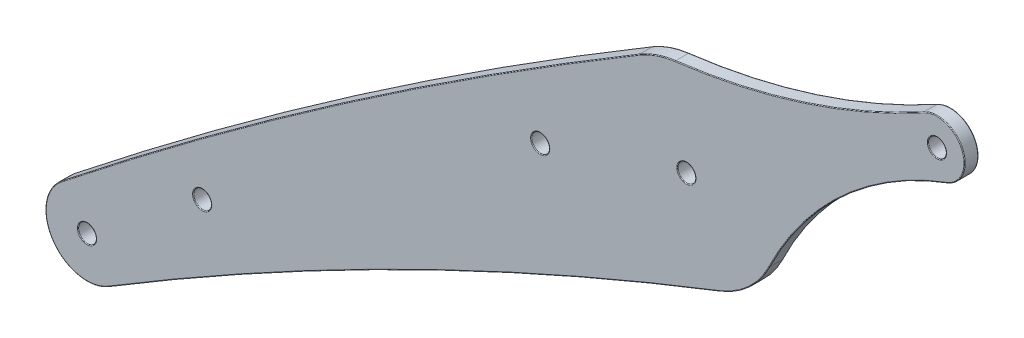
ISO-10303-21;
HEADER;
FILE_DESCRIPTION(('STEP AP214'),'2;1');
FILE_NAME('part.step','',(''),(''),'','','');
FILE_SCHEMA(('AUTOMOTIVE_DESIGN { 1 0 10303 214 1 1 1 1 }'));
ENDSEC;
DATA;
#1=APPLICATION_CONTEXT('core data for automotive mechanical design processes');
#2=APPLICATION_PROTOCOL_DEFINITION('international standard','automotive_design',2000,#1);
#3=PRODUCT_CONTEXT('',#1,'mechanical');
#4=PRODUCT('Part','Part','',(#3));
#5=PRODUCT_RELATED_PRODUCT_CATEGORY('part','',(#4));
#6=PRODUCT_DEFINITION_FORMATION('','',#4);
#7=PRODUCT_DEFINITION_CONTEXT('part definition',#1,'design');
#8=PRODUCT_DEFINITION('design','',#6,#7);
#9=PRODUCT_DEFINITION_SHAPE('','',#8);
#10=(LENGTH_UNIT() NAMED_UNIT(*) SI_UNIT(.MILLI.,.METRE.));
#11=(NAMED_UNIT(*) PLANE_ANGLE_UNIT() SI_UNIT($,.RADIAN.));
#12=(NAMED_UNIT(*) SI_UNIT($,.STERADIAN.) SOLID_ANGLE_UNIT());
#13=UNCERTAINTY_MEASURE_WITH_UNIT(LENGTH_MEASURE(1.E-05),#10,'distance_accuracy_value','');
#14=(GEOMETRIC_REPRESENTATION_CONTEXT(3) GLOBAL_UNCERTAINTY_ASSIGNED_CONTEXT((#13)) GLOBAL_UNIT_ASSIGNED_CONTEXT((#10,
#11,#12)) REPRESENTATION_CONTEXT('',''));
#15=CARTESIAN_POINT('',(0.,0.,0.));
#16=DIRECTION('',(0.,0.,1.));
#17=DIRECTION('',(1.,0.,0.));
#18=AXIS2_PLACEMENT_3D('',#15,#16,#17);
#19=CARTESIAN_POINT('',(-56.8731999979007,200.969479843934,-3.));
#20=DIRECTION('',(0.,0.,1.));
#21=DIRECTION('',(1.,0.,0.));
#22=AXIS2_PLACEMENT_3D('',#19,#20,#21);
#23=CYLINDRICAL_SURFACE('',#22,19.9999999999999);
#24=DIRECTION('',(0.,0.,1.));
#25=VECTOR('',#24,1.);
#26=CARTESIAN_POINT('',(-59.2972491522465,220.822035994146,-3.));
#27=LINE('',#26,#25);
#28=CARTESIAN_POINT('',(-59.2972491522465,220.822035994146,-2.85));
#29=VERTEX_POINT('',#28);
#30=CARTESIAN_POINT('',(-59.2972491522465,220.822035994146,-0.15));
#31=VERTEX_POINT('',#30);
#32=EDGE_CURVE('E153',#29,#31,#27,.T.);
#33=ORIENTED_EDGE('',*,*,#32,.F.);
#34=CARTESIAN_POINT('',(-56.8731999979007,200.969479843934,-2.85));
#35=DIRECTION('',(0.,0.,-1.));
#36=DIRECTION('',(-1.,0.,0.));
#37=AXIS2_PLACEMENT_3D('',#34,#35,#36);
#38=CIRCLE('',#37,19.9999999999999);
#39=CARTESIAN_POINT('',(-67.1157791789713,218.147651216914,-2.85));
#40=VERTEX_POINT('',#39);
#41=EDGE_CURVE('E148',#29,#40,#38,.F.);
#42=ORIENTED_EDGE('',*,*,#41,.T.);
#43=DIRECTION('',(0.,0.,1.));
#44=VECTOR('',#43,1.);
#45=CARTESIAN_POINT('',(-67.1157791789713,218.147651216914,-3.));
#46=LINE('',#45,#44);
#47=CARTESIAN_POINT('',(-67.1157791789713,218.147651216914,-0.15));
#48=VERTEX_POINT('',#47);
#49=EDGE_CURVE('E150',#40,#48,#46,.T.);
#50=ORIENTED_EDGE('',*,*,#49,.T.);
#51=CARTESIAN_POINT('',(-56.8731999979007,200.969479843934,-0.15));
#52=DIRECTION('',(0.,0.,-1.));
#53=DIRECTION('',(-1.,0.,0.));
#54=AXIS2_PLACEMENT_3D('',#51,#52,#53);
#55=CIRCLE('',#54,19.9999999999999);
#56=EDGE_CURVE('E159',#48,#31,#55,.T.);
#57=ORIENTED_EDGE('',*,*,#56,.T.);
#58=EDGE_LOOP('',(#33,#42,#50,#57));
#59=FACE_BOUND('',#58,.T.);
#60=ADVANCED_FACE('F34',(#59),#23,.T.);
#61=CARTESIAN_POINT('',(-77.4776178098393,369.716207120735,-3.));
#62=DIRECTION('',(0.,0.,1.));
#63=DIRECTION('',(1.,0.,0.));
#64=AXIS2_PLACEMENT_3D('',#61,#62,#63);
#65=CYLINDRICAL_SURFACE('',#64,150.);
#66=DIRECTION('',(0.,0.,1.));
#67=VECTOR('',#66,1.);
#68=CARTESIAN_POINT('',(-5.36711574066759,238.186455766404,-3.));
#69=LINE('',#68,#67);
#70=CARTESIAN_POINT('',(-5.36711574066759,238.186455766404,-2.85));
#71=VERTEX_POINT('',#70);
#72=CARTESIAN_POINT('',(-5.36711574066759,238.186455766404,-0.15));
#73=VERTEX_POINT('',#72);
#74=EDGE_CURVE('E370',#71,#73,#69,.T.);
#75=ORIENTED_EDGE('',*,*,#74,.F.);
#76=CARTESIAN_POINT('',(-77.4776178098393,369.716207120735,-2.85));
#77=DIRECTION('',(0.,0.,-1.));
#78=DIRECTION('',(-1.,0.,0.));
#79=AXIS2_PLACEMENT_3D('',#76,#77,#78);
#80=CIRCLE('',#79,150.);
#81=EDGE_CURVE('E242',#71,#29,#80,.T.);
#82=ORIENTED_EDGE('',*,*,#81,.T.);
#83=ORIENTED_EDGE('',*,*,#32,.T.);
#84=CARTESIAN_POINT('',(-77.4776178098393,369.716207120735,-0.15));
#85=DIRECTION('',(0.,0.,-1.));
#86=DIRECTION('',(-1.,0.,0.));
#87=AXIS2_PLACEMENT_3D('',#84,#85,#86);
#88=CIRCLE('',#87,150.);
#89=EDGE_CURVE('E239',#31,#73,#88,.F.);
#90=ORIENTED_EDGE('',*,*,#89,.T.);
#91=EDGE_LOOP('',(#75,#82,#83,#90));
#92=FACE_BOUND('',#91,.T.);
#93=ADVANCED_FACE('F376',(#92),#65,.F.);
#94=CARTESIAN_POINT('',(-2.48269565790066,232.925265712231,-3.));
#95=DIRECTION('',(0.,0.,1.));
#96=DIRECTION('',(1.,0.,0.));
#97=AXIS2_PLACEMENT_3D('',#94,#95,#96);
#98=CYLINDRICAL_SURFACE('',#97,6.00000000000003);
#99=DIRECTION('',(0.,0.,1.));
#100=VECTOR('',#99,1.);
#101=CARTESIAN_POINT('',(-0.3821118583825,227.304985674617,-3.));
#102=LINE('',#101,#100);
#103=CARTESIAN_POINT('',(-0.3821118583825,227.304985674617,-2.85));
#104=VERTEX_POINT('',#103);
#105=CARTESIAN_POINT('',(-0.3821118583825,227.304985674617,-0.15));
#106=VERTEX_POINT('',#105);
#107=EDGE_CURVE('E367',#104,#106,#102,.T.);
#108=ORIENTED_EDGE('',*,*,#107,.F.);
#109=CARTESIAN_POINT('',(-2.48269565790066,232.925265712231,-2.85));
#110=DIRECTION('',(0.,0.,-1.));
#111=DIRECTION('',(-1.,0.,0.));
#112=AXIS2_PLACEMENT_3D('',#109,#110,#111);
#113=CIRCLE('',#112,6.00000000000003);
#114=EDGE_CURVE('E237',#104,#71,#113,.F.);
#115=ORIENTED_EDGE('',*,*,#114,.T.);
#116=ORIENTED_EDGE('',*,*,#74,.T.);
#117=CARTESIAN_POINT('',(-2.48269565790066,232.925265712231,-0.15));
#118=DIRECTION('',(0.,0.,-1.));
#119=DIRECTION('',(-1.,0.,0.));
#120=AXIS2_PLACEMENT_3D('',#117,#118,#119);
#121=CIRCLE('',#120,6.00000000000003);
#122=EDGE_CURVE('E235',#73,#106,#121,.T.);
#123=ORIENTED_EDGE('',*,*,#122,.T.);
#124=EDGE_LOOP('',(#108,#115,#116,#123));
#125=FACE_BOUND('',#124,.T.);
#126=ADVANCED_FACE('F430',(#125),#98,.T.);
#127=CARTESIAN_POINT('',(24.1246991359958,161.735051902454,-3.));
#128=DIRECTION('',(0.,0.,1.));
#129=DIRECTION('',(1.,0.,0.));
#130=AXIS2_PLACEMENT_3D('',#127,#128,#129);
#131=CYLINDRICAL_SURFACE('',#130,70.);
#132=DIRECTION('',(0.,0.,1.));
#133=VECTOR('',#132,1.);
#134=CARTESIAN_POINT('',(-38.8736668570348,192.250718079161,-3.));
#135=LINE('',#134,#133);
#136=CARTESIAN_POINT('',(-38.8736668570348,192.250718079161,-2.85));
#137=VERTEX_POINT('',#136);
#138=CARTESIAN_POINT('',(-38.8736668570348,192.250718079161,-0.15));
#139=VERTEX_POINT('',#138);
#140=EDGE_CURVE('E361',#137,#139,#135,.T.);
#141=ORIENTED_EDGE('',*,*,#140,.F.);
#142=CARTESIAN_POINT('',(24.1246991359958,161.735051902454,-2.85));
#143=DIRECTION('',(0.,0.,-1.));
#144=DIRECTION('',(-1.,0.,0.));
#145=AXIS2_PLACEMENT_3D('',#142,#143,#144);
#146=CIRCLE('',#145,70.);
#147=EDGE_CURVE('E233',#137,#104,#146,.T.);
#148=ORIENTED_EDGE('',*,*,#147,.T.);
#149=ORIENTED_EDGE('',*,*,#107,.T.);
#150=CARTESIAN_POINT('',(24.1246991359958,161.735051902454,-0.15));
#151=DIRECTION('',(0.,0.,-1.));
#152=DIRECTION('',(-1.,0.,0.));
#153=AXIS2_PLACEMENT_3D('',#150,#151,#152);
#154=CIRCLE('',#153,70.);
#155=EDGE_CURVE('E231',#106,#139,#154,.F.);
#156=ORIENTED_EDGE('',*,*,#155,.T.);
#157=EDGE_LOOP('',(#141,#148,#149,#156));
#158=FACE_BOUND('',#157,.T.);
#159=ADVANCED_FACE('F724',(#158),#131,.F.);
#160=CARTESIAN_POINT('',(-56.8731999979007,200.969479843934,-3.));
#161=DIRECTION('',(0.,0.,1.));
#162=DIRECTION('',(1.,0.,0.));
#163=AXIS2_PLACEMENT_3D('',#160,#161,#162);
#164=CYLINDRICAL_SURFACE('',#163,20.0000000000001);
#165=DIRECTION('',(0.,0.,1.));
#166=VECTOR('',#165,1.);
#167=CARTESIAN_POINT('',(-49.6156195126461,182.332754662184,-3.));
#168=LINE('',#167,#166);
#169=CARTESIAN_POINT('',(-49.6156195126461,182.332754662184,-2.85));
#170=VERTEX_POINT('',#169);
#171=CARTESIAN_POINT('',(-49.6156195126461,182.332754662184,-0.15));
#172=VERTEX_POINT('',#171);
#173=EDGE_CURVE('E357',#170,#172,#168,.T.);
#174=ORIENTED_EDGE('',*,*,#173,.F.);
#175=CARTESIAN_POINT('',(-56.8731999979007,200.969479843934,-2.85));
#176=DIRECTION('',(0.,0.,-1.));
#177=DIRECTION('',(-1.,0.,0.));
#178=AXIS2_PLACEMENT_3D('',#175,#176,#177);
#179=CIRCLE('',#178,20.0000000000001);
#180=EDGE_CURVE('E229',#170,#137,#179,.F.);
#181=ORIENTED_EDGE('',*,*,#180,.T.);
#182=ORIENTED_EDGE('',*,*,#140,.T.);
#183=CARTESIAN_POINT('',(-56.8731999979007,200.969479843934,-0.15));
#184=DIRECTION('',(0.,0.,-1.));
#185=DIRECTION('',(-1.,0.,0.));
#186=AXIS2_PLACEMENT_3D('',#183,#184,#185);
#187=CIRCLE('',#186,20.0000000000001);
#188=EDGE_CURVE('E227',#139,#172,#187,.T.);
#189=ORIENTED_EDGE('',*,*,#188,.T.);
#190=EDGE_LOOP('',(#174,#181,#182,#189));
#191=FACE_BOUND('',#190,.T.);
#192=ADVANCED_FACE('F716',(#191),#164,.T.);
#193=CARTESIAN_POINT('',(258.831551110671,-609.728065562166,-3.));
#194=DIRECTION('',(0.,0.,1.));
#195=DIRECTION('',(1.,0.,0.));
#196=AXIS2_PLACEMENT_3D('',#193,#194,#195);
#197=CYLINDRICAL_SURFACE('',#196,850.);
#198=DIRECTION('',(0.,0.,1.));
#199=VECTOR('',#198,1.);
#200=CARTESIAN_POINT('',(-182.322813028778,116.82738793104,-3.));
#201=LINE('',#200,#199);
#202=CARTESIAN_POINT('',(-182.322813028778,116.82738793104,-2.85));
#203=VERTEX_POINT('',#202);
#204=CARTESIAN_POINT('',(-182.322813028778,116.82738793104,-0.15));
#205=VERTEX_POINT('',#204);
#206=EDGE_CURVE('E354',#203,#205,#201,.T.);
#207=ORIENTED_EDGE('',*,*,#206,.F.);
#208=CARTESIAN_POINT('',(258.831551110671,-609.728065562166,-2.85));
#209=DIRECTION('',(0.,0.,-1.));
#210=DIRECTION('',(-1.,0.,0.));
#211=AXIS2_PLACEMENT_3D('',#208,#209,#210);
#212=CIRCLE('',#211,850.);
#213=EDGE_CURVE('E225',#203,#170,#212,.T.);
#214=ORIENTED_EDGE('',*,*,#213,.T.);
#215=ORIENTED_EDGE('',*,*,#173,.T.);
#216=CARTESIAN_POINT('',(258.831551110671,-609.728065562166,-0.15));
#217=DIRECTION('',(0.,0.,-1.));
#218=DIRECTION('',(-1.,0.,0.));
#219=AXIS2_PLACEMENT_3D('',#216,#217,#218);
#220=CIRCLE('',#219,850.);
#221=EDGE_CURVE('E223',#172,#205,#220,.F.);
#222=ORIENTED_EDGE('',*,*,#221,.T.);
#223=EDGE_LOOP('',(#207,#214,#215,#222));
#224=FACE_BOUND('',#223,.T.);
#225=ADVANCED_FACE('F353',(#224),#197,.F.);
#226=CARTESIAN_POINT('',(-186.993859237313,124.520328026851,-3.));
#227=DIRECTION('',(0.,0.,1.));
#228=DIRECTION('',(1.,0.,0.));
#229=AXIS2_PLACEMENT_3D('',#226,#227,#228);
#230=CYLINDRICAL_SURFACE('',#229,8.99999999999998);
#231=DIRECTION('',(0.,0.,1.));
#232=VECTOR('',#231,1.);
#233=CARTESIAN_POINT('',(-192.584952529802,131.572964115201,-3.));
#234=LINE('',#233,#232);
#235=CARTESIAN_POINT('',(-192.584952529802,131.572964115201,-2.85));
#236=VERTEX_POINT('',#235);
#237=CARTESIAN_POINT('',(-192.584952529802,131.572964115201,-0.15));
#238=VERTEX_POINT('',#237);
#239=EDGE_CURVE('E170',#236,#238,#234,.T.);
#240=ORIENTED_EDGE('',*,*,#239,.F.);
#241=CARTESIAN_POINT('',(-186.993859237313,124.520328026851,-2.85));
#242=DIRECTION('',(0.,0.,-1.));
#243=DIRECTION('',(-1.,0.,0.));
#244=AXIS2_PLACEMENT_3D('',#241,#242,#243);
#245=CIRCLE('',#244,8.99999999999998);
#246=EDGE_CURVE('E221',#236,#203,#245,.F.);
#247=ORIENTED_EDGE('',*,*,#246,.T.);
#248=ORIENTED_EDGE('',*,*,#206,.T.);
#249=CARTESIAN_POINT('',(-186.993859237313,124.520328026851,-0.15));
#250=DIRECTION('',(0.,0.,-1.));
#251=DIRECTION('',(-1.,0.,0.));
#252=AXIS2_PLACEMENT_3D('',#249,#250,#251);
#253=CIRCLE('',#252,8.99999999999998);
#254=EDGE_CURVE('E219',#205,#238,#253,.T.);
#255=ORIENTED_EDGE('',*,*,#254,.T.);
#256=EDGE_LOOP('',(#240,#247,#248,#255));
#257=FACE_BOUND('',#256,.T.);
#258=ADVANCED_FACE('F359',(#257),#230,.T.);
#259=CARTESIAN_POINT('',(521.832523732588,-769.597202729485,-3.));
#260=DIRECTION('',(0.,0.,1.));
#261=DIRECTION('',(1.,0.,0.));
#262=AXIS2_PLACEMENT_3D('',#259,#260,#261);
#263=CYLINDRICAL_SURFACE('',#262,1150.);
#264=ORIENTED_EDGE('',*,*,#49,.F.);
#265=CARTESIAN_POINT('',(521.832523732588,-769.597202729485,-2.85));
#266=DIRECTION('',(0.,0.,-1.));
#267=DIRECTION('',(-1.,0.,0.));
#268=AXIS2_PLACEMENT_3D('',#265,#266,#267);
#269=CIRCLE('',#268,1150.);
#270=EDGE_CURVE('E166',#40,#236,#269,.F.);
#271=ORIENTED_EDGE('',*,*,#270,.T.);
#272=ORIENTED_EDGE('',*,*,#239,.T.);
#273=CARTESIAN_POINT('',(521.832523732588,-769.597202729485,-0.15));
#274=DIRECTION('',(0.,0.,-1.));
#275=DIRECTION('',(-1.,0.,0.));
#276=AXIS2_PLACEMENT_3D('',#273,#274,#275);
#277=CIRCLE('',#276,1150.);
#278=EDGE_CURVE('E169',#238,#48,#277,.T.);
#279=ORIENTED_EDGE('',*,*,#278,.T.);
#280=EDGE_LOOP('',(#264,#271,#272,#279));
#281=FACE_BOUND('',#280,.T.);
#282=ADVANCED_FACE('F163',(#281),#263,.T.);
#283=CARTESIAN_POINT('',(-67.17540890387,285.342843482334,-3.));
#284=DIRECTION('',(0.,0.,-1.));
#285=DIRECTION('',(-1.,0.,0.));
#286=AXIS2_PLACEMENT_3D('',#283,#284,#285);
#287=PLANE('',#286);
#288=CARTESIAN_POINT('',(-186.993859237313,124.520328026851,-3.));
#289=DIRECTION('',(0.,0.,-1.));
#290=DIRECTION('',(-1.,0.,0.));
#291=AXIS2_PLACEMENT_3D('',#288,#289,#290);
#292=CIRCLE('',#291,8.84999999999998);
#293=CARTESIAN_POINT('',(-182.40066379892,116.955603599304,-3.));
#294=VERTEX_POINT('',#293);
#295=CARTESIAN_POINT('',(-192.491767641593,131.455420180395,-3.));
#296=VERTEX_POINT('',#295);
#297=EDGE_CURVE('E215',#294,#296,#292,.T.);
#298=ORIENTED_EDGE('',*,*,#297,.T.);
#299=CARTESIAN_POINT('',(521.832523732588,-769.597202729485,-3.));
#300=DIRECTION('',(0.,0.,-1.));
#301=DIRECTION('',(-1.,0.,0.));
#302=AXIS2_PLACEMENT_3D('',#299,#300,#301);
#303=CIRCLE('',#302,1149.85);
#304=CARTESIAN_POINT('',(-67.0389598351133,218.018814931617,-3.));
#305=VERTEX_POINT('',#304);
#306=EDGE_CURVE('E217',#296,#305,#303,.T.);
#307=ORIENTED_EDGE('',*,*,#306,.T.);
#308=CARTESIAN_POINT('',(-56.8731999979007,200.969479843934,-3.));
#309=DIRECTION('',(0.,0.,-1.));
#310=DIRECTION('',(-1.,0.,0.));
#311=AXIS2_PLACEMENT_3D('',#308,#309,#310);
#312=CIRCLE('',#311,19.8499999999999);
#313=CARTESIAN_POINT('',(-59.2790687835889,220.673141823019,-3.));
#314=VERTEX_POINT('',#313);
#315=EDGE_CURVE('E176',#305,#314,#312,.T.);
#316=ORIENTED_EDGE('',*,*,#315,.T.);
#317=CARTESIAN_POINT('',(-77.4776178098393,369.716207120735,-3.));
#318=DIRECTION('',(0.,0.,-1.));
#319=DIRECTION('',(-1.,0.,0.));
#320=AXIS2_PLACEMENT_3D('',#317,#318,#319);
#321=CIRCLE('',#320,150.15);
#322=CARTESIAN_POINT('',(-5.29500523859841,238.05492601505,-3.));
#323=VERTEX_POINT('',#322);
#324=EDGE_CURVE('E205',#314,#323,#321,.F.);
#325=ORIENTED_EDGE('',*,*,#324,.T.);
#326=CARTESIAN_POINT('',(-2.48269565790066,232.925265712231,-3.));
#327=DIRECTION('',(0.,0.,-1.));
#328=DIRECTION('',(-1.,0.,0.));
#329=AXIS2_PLACEMENT_3D('',#326,#327,#328);
#330=CIRCLE('',#329,5.85000000000003);
#331=CARTESIAN_POINT('',(-0.434626453370453,227.445492675558,-3.));
#332=VERTEX_POINT('',#331);
#333=EDGE_CURVE('E207',#323,#332,#330,.T.);
#334=ORIENTED_EDGE('',*,*,#333,.T.);
#335=CARTESIAN_POINT('',(24.1246991359958,161.735051902454,-3.));
#336=DIRECTION('',(0.,0.,-1.));
#337=DIRECTION('',(-1.,0.,0.));
#338=AXIS2_PLACEMENT_3D('',#335,#336,#337);
#339=CIRCLE('',#338,70.15);
#340=CARTESIAN_POINT('',(-39.0086633555913,192.316108792396,-3.));
#341=VERTEX_POINT('',#340);
#342=EDGE_CURVE('E209',#332,#341,#339,.F.);
#343=ORIENTED_EDGE('',*,*,#342,.T.);
#344=CARTESIAN_POINT('',(-56.8731999979007,200.969479843934,-3.));
#345=DIRECTION('',(0.,0.,-1.));
#346=DIRECTION('',(-1.,0.,0.));
#347=AXIS2_PLACEMENT_3D('',#344,#345,#346);
#348=CIRCLE('',#347,19.8500000000001);
#349=CARTESIAN_POINT('',(-49.6700513662855,182.472530101047,-3.));
#350=VERTEX_POINT('',#349);
#351=EDGE_CURVE('E211',#341,#350,#348,.T.);
#352=ORIENTED_EDGE('',*,*,#351,.T.);
#353=CARTESIAN_POINT('',(258.831551110671,-609.728065562166,-3.));
#354=DIRECTION('',(0.,0.,-1.));
#355=DIRECTION('',(-1.,0.,0.));
#356=AXIS2_PLACEMENT_3D('',#353,#354,#355);
#357=CIRCLE('',#356,850.15);
#358=EDGE_CURVE('E213',#350,#294,#357,.F.);
#359=ORIENTED_EDGE('',*,*,#358,.T.);
#360=EDGE_LOOP('',(#298,#307,#316,#325,#334,#343,#352,#359));
#361=FACE_BOUND('',#360,.T.);
#362=CARTESIAN_POINT('',(-2.48269565790066,232.925265712231,-3.));
#363=DIRECTION('',(0.,0.,-1.));
#364=DIRECTION('',(-1.,0.,0.));
#365=AXIS2_PLACEMENT_3D('',#362,#363,#364);
#366=CIRCLE('',#365,2.1);
#367=CARTESIAN_POINT('',(-4.58269565790066,232.925265712231,-3.));
#368=VERTEX_POINT('',#367);
#369=EDGE_CURVE('E201',#368,#368,#366,.F.);
#370=ORIENTED_EDGE('',*,*,#369,.T.);
#371=EDGE_LOOP('',(#370));
#372=FACE_BOUND('',#371,.T.);
#373=CARTESIAN_POINT('',(-56.8731999979007,200.969479843934,-3.));
#374=DIRECTION('',(0.,0.,-1.));
#375=DIRECTION('',(-1.,0.,0.));
#376=AXIS2_PLACEMENT_3D('',#373,#374,#375);
#377=CIRCLE('',#376,2.1);
#378=CARTESIAN_POINT('',(-58.9731999979007,200.969479843934,-3.));
#379=VERTEX_POINT('',#378);
#380=EDGE_CURVE('E198',#379,#379,#377,.F.);
#381=ORIENTED_EDGE('',*,*,#380,.T.);
#382=EDGE_LOOP('',(#381));
#383=FACE_BOUND('',#382,.T.);
#384=CARTESIAN_POINT('',(-88.6231999979007,190.664661820758,-3.));
#385=DIRECTION('',(0.,0.,-1.));
#386=DIRECTION('',(-1.,0.,0.));
#387=AXIS2_PLACEMENT_3D('',#384,#385,#386);
#388=CIRCLE('',#387,2.09999999999999);
#389=CARTESIAN_POINT('',(-90.7231999979007,190.664661820758,-3.));
#390=VERTEX_POINT('',#389);
#391=EDGE_CURVE('E195',#390,#390,#388,.F.);
#392=ORIENTED_EDGE('',*,*,#391,.T.);
#393=EDGE_LOOP('',(#392));
#394=FACE_BOUND('',#393,.T.);
#395=CARTESIAN_POINT('',(-161.993859237313,143.416067608263,-3.));
#396=DIRECTION('',(0.,0.,-1.));
#397=DIRECTION('',(-1.,0.,0.));
#398=AXIS2_PLACEMENT_3D('',#395,#396,#397);
#399=CIRCLE('',#398,2.10000000000001);
#400=CARTESIAN_POINT('',(-164.093859237313,143.416067608263,-3.));
#401=VERTEX_POINT('',#400);
#402=EDGE_CURVE('E189',#401,#401,#399,.F.);
#403=ORIENTED_EDGE('',*,*,#402,.T.);
#404=EDGE_LOOP('',(#403));
#405=FACE_BOUND('',#404,.T.);
#406=CARTESIAN_POINT('',(-186.993859237313,124.520328026851,-3.));
#407=DIRECTION('',(0.,0.,-1.));
#408=DIRECTION('',(-1.,0.,0.));
#409=AXIS2_PLACEMENT_3D('',#406,#407,#408);
#410=CIRCLE('',#409,2.10000000000001);
#411=CARTESIAN_POINT('',(-189.093859237313,124.520328026851,-3.));
#412=VERTEX_POINT('',#411);
#413=EDGE_CURVE('E186',#412,#412,#410,.F.);
#414=ORIENTED_EDGE('',*,*,#413,.T.);
#415=EDGE_LOOP('',(#414));
#416=FACE_BOUND('',#415,.T.);
#417=ADVANCED_FACE('F392',(#361,#372,#383,#394,#405,#416),#287,.T.);
#418=CARTESIAN_POINT('',(-67.17540890387,285.342843482334,0.));
#419=DIRECTION('',(0.,0.,-1.));
#420=DIRECTION('',(-1.,0.,0.));
#421=AXIS2_PLACEMENT_3D('',#418,#419,#420);
#422=PLANE('',#421);
#423=CARTESIAN_POINT('',(-2.48269565790066,232.925265712231,0.));
#424=DIRECTION('',(0.,0.,-1.));
#425=DIRECTION('',(-1.,0.,0.));
#426=AXIS2_PLACEMENT_3D('',#423,#424,#425);
#427=CIRCLE('',#426,5.85000000000003);
#428=CARTESIAN_POINT('',(-0.434626453370453,227.445492675558,0.));
#429=VERTEX_POINT('',#428);
#430=CARTESIAN_POINT('',(-5.29500523859842,238.05492601505,0.));
#431=VERTEX_POINT('',#430);
#432=EDGE_CURVE('E43',#429,#431,#427,.F.);
#433=ORIENTED_EDGE('',*,*,#432,.T.);
#434=CARTESIAN_POINT('',(-77.4776178098393,369.716207120735,0.));
#435=DIRECTION('',(0.,0.,-1.));
#436=DIRECTION('',(-1.,0.,0.));
#437=AXIS2_PLACEMENT_3D('',#434,#435,#436);
#438=CIRCLE('',#437,150.15);
#439=CARTESIAN_POINT('',(-59.2790687835889,220.673141823019,0.));
#440=VERTEX_POINT('',#439);
#441=EDGE_CURVE('E11',#431,#440,#438,.T.);
#442=ORIENTED_EDGE('',*,*,#441,.T.);
#443=CARTESIAN_POINT('',(-56.8731999979007,200.969479843934,0.));
#444=DIRECTION('',(0.,0.,-1.));
#445=DIRECTION('',(-1.,0.,0.));
#446=AXIS2_PLACEMENT_3D('',#443,#444,#445);
#447=CIRCLE('',#446,19.8499999999999);
#448=CARTESIAN_POINT('',(-67.0389598351133,218.018814931617,0.));
#449=VERTEX_POINT('',#448);
#450=EDGE_CURVE('E289',#440,#449,#447,.F.);
#451=ORIENTED_EDGE('',*,*,#450,.T.);
#452=CARTESIAN_POINT('',(521.832523732588,-769.597202729485,0.));
#453=DIRECTION('',(0.,0.,-1.));
#454=DIRECTION('',(-1.,0.,0.));
#455=AXIS2_PLACEMENT_3D('',#452,#453,#454);
#456=CIRCLE('',#455,1149.85);
#457=CARTESIAN_POINT('',(-192.491767641593,131.455420180394,0.));
#458=VERTEX_POINT('',#457);
#459=EDGE_CURVE('E291',#449,#458,#456,.F.);
#460=ORIENTED_EDGE('',*,*,#459,.T.);
#461=CARTESIAN_POINT('',(-186.993859237313,124.520328026851,0.));
#462=DIRECTION('',(0.,0.,-1.));
#463=DIRECTION('',(-1.,0.,0.));
#464=AXIS2_PLACEMENT_3D('',#461,#462,#463);
#465=CIRCLE('',#464,8.84999999999998);
#466=CARTESIAN_POINT('',(-182.40066379892,116.955603599304,0.));
#467=VERTEX_POINT('',#466);
#468=EDGE_CURVE('E293',#458,#467,#465,.F.);
#469=ORIENTED_EDGE('',*,*,#468,.T.);
#470=CARTESIAN_POINT('',(258.831551110671,-609.728065562166,0.));
#471=DIRECTION('',(0.,0.,-1.));
#472=DIRECTION('',(-1.,0.,0.));
#473=AXIS2_PLACEMENT_3D('',#470,#471,#472);
#474=CIRCLE('',#473,850.15);
#475=CARTESIAN_POINT('',(-49.6700513662854,182.472530101047,0.));
#476=VERTEX_POINT('',#475);
#477=EDGE_CURVE('E295',#467,#476,#474,.T.);
#478=ORIENTED_EDGE('',*,*,#477,.T.);
#479=CARTESIAN_POINT('',(-56.8731999979007,200.969479843934,0.));
#480=DIRECTION('',(0.,0.,-1.));
#481=DIRECTION('',(-1.,0.,0.));
#482=AXIS2_PLACEMENT_3D('',#479,#480,#481);
#483=CIRCLE('',#482,19.8500000000001);
#484=CARTESIAN_POINT('',(-39.0086633555912,192.316108792396,0.));
#485=VERTEX_POINT('',#484);
#486=EDGE_CURVE('E297',#476,#485,#483,.F.);
#487=ORIENTED_EDGE('',*,*,#486,.T.);
#488=CARTESIAN_POINT('',(24.1246991359958,161.735051902454,0.));
#489=DIRECTION('',(0.,0.,-1.));
#490=DIRECTION('',(-1.,0.,0.));
#491=AXIS2_PLACEMENT_3D('',#488,#489,#490);
#492=CIRCLE('',#491,70.15);
#493=EDGE_CURVE('E54',#485,#429,#492,.T.);
#494=ORIENTED_EDGE('',*,*,#493,.T.);
#495=EDGE_LOOP('',(#433,#442,#451,#460,#469,#478,#487,#494));
#496=FACE_BOUND('',#495,.T.);
#497=CARTESIAN_POINT('',(-2.48269565790066,232.925265712231,0.));
#498=DIRECTION('',(0.,0.,-1.));
#499=DIRECTION('',(-1.,0.,0.));
#500=AXIS2_PLACEMENT_3D('',#497,#498,#499);
#501=CIRCLE('',#500,2.1);
#502=CARTESIAN_POINT('',(-4.58269565790066,232.925265712231,0.));
#503=VERTEX_POINT('',#502);
#504=EDGE_CURVE('E286',#503,#503,#501,.T.);
#505=ORIENTED_EDGE('',*,*,#504,.T.);
#506=EDGE_LOOP('',(#505));
#507=FACE_BOUND('',#506,.T.);
#508=CARTESIAN_POINT('',(-56.8731999979007,200.969479843934,0.));
#509=DIRECTION('',(0.,0.,-1.));
#510=DIRECTION('',(-1.,0.,0.));
#511=AXIS2_PLACEMENT_3D('',#508,#509,#510);
#512=CIRCLE('',#511,2.1);
#513=CARTESIAN_POINT('',(-58.9731999979007,200.969479843934,0.));
#514=VERTEX_POINT('',#513);
#515=EDGE_CURVE('E283',#514,#514,#512,.T.);
#516=ORIENTED_EDGE('',*,*,#515,.T.);
#517=EDGE_LOOP('',(#516));
#518=FACE_BOUND('',#517,.T.);
#519=CARTESIAN_POINT('',(-88.6231999979007,190.664661820758,0.));
#520=DIRECTION('',(0.,0.,-1.));
#521=DIRECTION('',(-1.,0.,0.));
#522=AXIS2_PLACEMENT_3D('',#519,#520,#521);
#523=CIRCLE('',#522,2.09999999999999);
#524=CARTESIAN_POINT('',(-90.7231999979007,190.664661820758,0.));
#525=VERTEX_POINT('',#524);
#526=EDGE_CURVE('E280',#525,#525,#523,.T.);
#527=ORIENTED_EDGE('',*,*,#526,.T.);
#528=EDGE_LOOP('',(#527));
#529=FACE_BOUND('',#528,.T.);
#530=CARTESIAN_POINT('',(-161.993859237313,143.416067608263,0.));
#531=DIRECTION('',(0.,0.,-1.));
#532=DIRECTION('',(-1.,0.,0.));
#533=AXIS2_PLACEMENT_3D('',#530,#531,#532);
#534=CIRCLE('',#533,2.10000000000001);
#535=CARTESIAN_POINT('',(-164.093859237313,143.416067608263,0.));
#536=VERTEX_POINT('',#535);
#537=EDGE_CURVE('E277',#536,#536,#534,.T.);
#538=ORIENTED_EDGE('',*,*,#537,.T.);
#539=EDGE_LOOP('',(#538));
#540=FACE_BOUND('',#539,.T.);
#541=CARTESIAN_POINT('',(-186.993859237313,124.520328026851,0.));
#542=DIRECTION('',(0.,0.,-1.));
#543=DIRECTION('',(-1.,0.,0.));
#544=AXIS2_PLACEMENT_3D('',#541,#542,#543);
#545=CIRCLE('',#544,2.10000000000001);
#546=CARTESIAN_POINT('',(-189.093859237313,124.520328026851,0.));
#547=VERTEX_POINT('',#546);
#548=EDGE_CURVE('E274',#547,#547,#545,.T.);
#549=ORIENTED_EDGE('',*,*,#548,.T.);
#550=EDGE_LOOP('',(#549));
#551=FACE_BOUND('',#550,.T.);
#552=ADVANCED_FACE('F388',(#496,#507,#518,#529,#540,#551),#422,.F.);
#553=CARTESIAN_POINT('',(-2.48269565790066,232.925265712231,0.));
#554=DIRECTION('',(0.,0.,1.));
#555=DIRECTION('',(1.,0.,0.));
#556=AXIS2_PLACEMENT_3D('',#553,#554,#555);
#557=CYLINDRICAL_SURFACE('',#556,1.95);
#558=CARTESIAN_POINT('',(-2.48269565790066,232.925265712231,-2.85));
#559=DIRECTION('',(0.,0.,-1.));
#560=DIRECTION('',(-1.,0.,0.));
#561=AXIS2_PLACEMENT_3D('',#558,#559,#560);
#562=CIRCLE('',#561,1.95);
#563=CARTESIAN_POINT('',(-4.43269565790066,232.925265712231,-2.85));
#564=VERTEX_POINT('',#563);
#565=EDGE_CURVE('E247',#564,#564,#562,.T.);
#566=ORIENTED_EDGE('',*,*,#565,.T.);
#567=EDGE_LOOP('',(#566));
#568=FACE_BOUND('',#567,.T.);
#569=CARTESIAN_POINT('',(-2.48269565790066,232.925265712231,-0.15));
#570=DIRECTION('',(0.,0.,-1.));
#571=DIRECTION('',(-1.,0.,0.));
#572=AXIS2_PLACEMENT_3D('',#569,#570,#571);
#573=CIRCLE('',#572,1.95);
#574=CARTESIAN_POINT('',(-4.43269565790066,232.925265712231,-0.15));
#575=VERTEX_POINT('',#574);
#576=EDGE_CURVE('E158',#575,#575,#573,.F.);
#577=ORIENTED_EDGE('',*,*,#576,.T.);
#578=EDGE_LOOP('',(#577));
#579=FACE_BOUND('',#578,.T.);
#580=ADVANCED_FACE('F391',(#568,#579),#557,.F.);
#581=CARTESIAN_POINT('',(-56.8731999979007,200.969479843934,0.));
#582=DIRECTION('',(0.,0.,1.));
#583=DIRECTION('',(1.,0.,0.));
#584=AXIS2_PLACEMENT_3D('',#581,#582,#583);
#585=CYLINDRICAL_SURFACE('',#584,1.95);
#586=CARTESIAN_POINT('',(-56.8731999979007,200.969479843934,-2.85));
#587=DIRECTION('',(0.,0.,-1.));
#588=DIRECTION('',(-1.,0.,0.));
#589=AXIS2_PLACEMENT_3D('',#586,#587,#588);
#590=CIRCLE('',#589,1.95);
#591=CARTESIAN_POINT('',(-58.8231999979007,200.969479843934,-2.85));
#592=VERTEX_POINT('',#591);
#593=EDGE_CURVE('E253',#592,#592,#590,.T.);
#594=ORIENTED_EDGE('',*,*,#593,.T.);
#595=EDGE_LOOP('',(#594));
#596=FACE_BOUND('',#595,.T.);
#597=CARTESIAN_POINT('',(-56.8731999979007,200.969479843934,-0.15));
#598=DIRECTION('',(0.,0.,-1.));
#599=DIRECTION('',(-1.,0.,0.));
#600=AXIS2_PLACEMENT_3D('',#597,#598,#599);
#601=CIRCLE('',#600,1.95);
#602=CARTESIAN_POINT('',(-58.8231999979007,200.969479843934,-0.15));
#603=VERTEX_POINT('',#602);
#604=EDGE_CURVE('E250',#603,#603,#601,.F.);
#605=ORIENTED_EDGE('',*,*,#604,.T.);
#606=EDGE_LOOP('',(#605));
#607=FACE_BOUND('',#606,.T.);
#608=ADVANCED_FACE('F665',(#596,#607),#585,.F.);
#609=CARTESIAN_POINT('',(-88.6231999979007,190.664661820758,0.));
#610=DIRECTION('',(0.,0.,1.));
#611=DIRECTION('',(1.,0.,0.));
#612=AXIS2_PLACEMENT_3D('',#609,#610,#611);
#613=CYLINDRICAL_SURFACE('',#612,1.94999999999999);
#614=CARTESIAN_POINT('',(-88.6231999979007,190.664661820758,-2.85));
#615=DIRECTION('',(0.,0.,-1.));
#616=DIRECTION('',(-1.,0.,0.));
#617=AXIS2_PLACEMENT_3D('',#614,#615,#616);
#618=CIRCLE('',#617,1.94999999999999);
#619=CARTESIAN_POINT('',(-90.5731999979007,190.664661820758,-2.85));
#620=VERTEX_POINT('',#619);
#621=EDGE_CURVE('E259',#620,#620,#618,.T.);
#622=ORIENTED_EDGE('',*,*,#621,.T.);
#623=EDGE_LOOP('',(#622));
#624=FACE_BOUND('',#623,.T.);
#625=CARTESIAN_POINT('',(-88.6231999979007,190.664661820758,-0.15));
#626=DIRECTION('',(0.,0.,-1.));
#627=DIRECTION('',(-1.,0.,0.));
#628=AXIS2_PLACEMENT_3D('',#625,#626,#627);
#629=CIRCLE('',#628,1.94999999999999);
#630=CARTESIAN_POINT('',(-90.5731999979007,190.664661820758,-0.15));
#631=VERTEX_POINT('',#630);
#632=EDGE_CURVE('E256',#631,#631,#629,.F.);
#633=ORIENTED_EDGE('',*,*,#632,.T.);
#634=EDGE_LOOP('',(#633));
#635=FACE_BOUND('',#634,.T.);
#636=ADVANCED_FACE('F422',(#624,#635),#613,.F.);
#637=CARTESIAN_POINT('',(-161.993859237313,143.416067608263,0.));
#638=DIRECTION('',(0.,0.,1.));
#639=DIRECTION('',(1.,0.,0.));
#640=AXIS2_PLACEMENT_3D('',#637,#638,#639);
#641=CYLINDRICAL_SURFACE('',#640,1.95000000000001);
#642=CARTESIAN_POINT('',(-161.993859237313,143.416067608263,-2.85));
#643=DIRECTION('',(0.,0.,-1.));
#644=DIRECTION('',(-1.,0.,0.));
#645=AXIS2_PLACEMENT_3D('',#642,#643,#644);
#646=CIRCLE('',#645,1.95000000000001);
#647=CARTESIAN_POINT('',(-163.943859237313,143.416067608263,-2.85));
#648=VERTEX_POINT('',#647);
#649=EDGE_CURVE('E265',#648,#648,#646,.T.);
#650=ORIENTED_EDGE('',*,*,#649,.T.);
#651=EDGE_LOOP('',(#650));
#652=FACE_BOUND('',#651,.T.);
#653=CARTESIAN_POINT('',(-161.993859237313,143.416067608263,-0.15));
#654=DIRECTION('',(0.,0.,-1.));
#655=DIRECTION('',(-1.,0.,0.));
#656=AXIS2_PLACEMENT_3D('',#653,#654,#655);
#657=CIRCLE('',#656,1.95000000000001);
#658=CARTESIAN_POINT('',(-163.943859237313,143.416067608263,-0.15));
#659=VERTEX_POINT('',#658);
#660=EDGE_CURVE('E262',#659,#659,#657,.F.);
#661=ORIENTED_EDGE('',*,*,#660,.T.);
#662=EDGE_LOOP('',(#661));
#663=FACE_BOUND('',#662,.T.);
#664=ADVANCED_FACE('F412',(#652,#663),#641,.F.);
#665=CARTESIAN_POINT('',(-186.993859237313,124.520328026851,0.));
#666=DIRECTION('',(0.,0.,1.));
#667=DIRECTION('',(1.,0.,0.));
#668=AXIS2_PLACEMENT_3D('',#665,#666,#667);
#669=CYLINDRICAL_SURFACE('',#668,1.95000000000001);
#670=CARTESIAN_POINT('',(-186.993859237313,124.520328026851,-2.85));
#671=DIRECTION('',(0.,0.,-1.));
#672=DIRECTION('',(-1.,0.,0.));
#673=AXIS2_PLACEMENT_3D('',#670,#671,#672);
#674=CIRCLE('',#673,1.95000000000001);
#675=CARTESIAN_POINT('',(-188.943859237313,124.520328026851,-2.85));
#676=VERTEX_POINT('',#675);
#677=EDGE_CURVE('E271',#676,#676,#674,.T.);
#678=ORIENTED_EDGE('',*,*,#677,.T.);
#679=EDGE_LOOP('',(#678));
#680=FACE_BOUND('',#679,.T.);
#681=CARTESIAN_POINT('',(-186.993859237313,124.520328026851,-0.15));
#682=DIRECTION('',(0.,0.,-1.));
#683=DIRECTION('',(-1.,0.,0.));
#684=AXIS2_PLACEMENT_3D('',#681,#682,#683);
#685=CIRCLE('',#684,1.95000000000001);
#686=CARTESIAN_POINT('',(-188.943859237313,124.520328026851,-0.15));
#687=VERTEX_POINT('',#686);
#688=EDGE_CURVE('E268',#687,#687,#685,.F.);
#689=ORIENTED_EDGE('',*,*,#688,.T.);
#690=EDGE_LOOP('',(#689));
#691=FACE_BOUND('',#690,.T.);
#692=ADVANCED_FACE('F409',(#680,#691),#669,.F.);
#693=CARTESIAN_POINT('',(24.1246991359958,161.735051902454,-2.85));
#694=DIRECTION('',(0.,0.,-1.));
#695=DIRECTION('',(-1.,0.,0.));
#696=AXIS2_PLACEMENT_3D('',#693,#694,#695);
#697=TOROIDAL_SURFACE('',#696,70.15,0.15);
#698=CARTESIAN_POINT('',(-39.0086633555913,192.316108792396,-2.85));
#699=DIRECTION('',(-0.435938088238644,-0.899976657043302,0.));
#700=DIRECTION('',(0.899976657043302,-0.435938088238644,0.));
#701=AXIS2_PLACEMENT_3D('',#698,#699,#700);
#702=CIRCLE('',#701,0.15);
#703=EDGE_CURVE('E312',#341,#137,#702,.T.);
#704=ORIENTED_EDGE('',*,*,#703,.F.);
#705=ORIENTED_EDGE('',*,*,#342,.F.);
#706=CARTESIAN_POINT('',(-0.434626453370453,227.445492675558,-2.85));
#707=DIRECTION('',(0.936713339602321,0.350097299919703,0.));
#708=DIRECTION('',(-0.350097299919703,0.936713339602321,0.));
#709=AXIS2_PLACEMENT_3D('',#706,#707,#708);
#710=CIRCLE('',#709,0.15);
#711=EDGE_CURVE('E171',#104,#332,#710,.T.);
#712=ORIENTED_EDGE('',*,*,#711,.F.);
#713=ORIENTED_EDGE('',*,*,#147,.F.);
#714=EDGE_LOOP('',(#704,#705,#712,#713));
#715=FACE_BOUND('',#714,.T.);
#716=ADVANCED_FACE('F411',(#715),#697,.T.);
#717=CARTESIAN_POINT('',(-2.48269565790066,232.925265712231,-2.85));
#718=DIRECTION('',(0.,0.,-1.));
#719=DIRECTION('',(-1.,0.,0.));
#720=AXIS2_PLACEMENT_3D('',#717,#718,#719);
#721=TOROIDAL_SURFACE('',#720,5.85000000000003,0.15);
#722=ORIENTED_EDGE('',*,*,#711,.T.);
#723=ORIENTED_EDGE('',*,*,#333,.F.);
#724=CARTESIAN_POINT('',(-5.29500523859841,238.05492601505,-2.85));
#725=DIRECTION('',(-0.876865009028867,-0.480736680461149,0.));
#726=DIRECTION('',(0.480736680461149,-0.876865009028867,0.));
#727=AXIS2_PLACEMENT_3D('',#724,#725,#726);
#728=CIRCLE('',#727,0.15);
#729=EDGE_CURVE('E309',#71,#323,#728,.T.);
#730=ORIENTED_EDGE('',*,*,#729,.F.);
#731=ORIENTED_EDGE('',*,*,#114,.F.);
#732=EDGE_LOOP('',(#722,#723,#730,#731));
#733=FACE_BOUND('',#732,.T.);
#734=ADVANCED_FACE('F419',(#733),#721,.T.);
#735=CARTESIAN_POINT('',(-56.8731999979007,200.969479843934,-2.85));
#736=DIRECTION('',(0.,0.,-1.));
#737=DIRECTION('',(-1.,0.,0.));
#738=AXIS2_PLACEMENT_3D('',#735,#736,#737);
#739=TOROIDAL_SURFACE('',#738,19.8500000000001,0.15);
#740=ORIENTED_EDGE('',*,*,#703,.T.);
#741=ORIENTED_EDGE('',*,*,#180,.F.);
#742=CARTESIAN_POINT('',(-49.6700513662855,182.472530101047,-2.85));
#743=DIRECTION('',(-0.931836259087469,-0.36287902426273,0.));
#744=DIRECTION('',(0.36287902426273,-0.931836259087469,0.));
#745=AXIS2_PLACEMENT_3D('',#742,#743,#744);
#746=CIRCLE('',#745,0.15);
#747=EDGE_CURVE('E306',#350,#170,#746,.T.);
#748=ORIENTED_EDGE('',*,*,#747,.F.);
#749=ORIENTED_EDGE('',*,*,#351,.F.);
#750=EDGE_LOOP('',(#740,#741,#748,#749));
#751=FACE_BOUND('',#750,.T.);
#752=ADVANCED_FACE('F451',(#751),#739,.T.);
#753=CARTESIAN_POINT('',(-77.4776178098393,369.716207120735,-2.85));
#754=DIRECTION('',(0.,0.,-1.));
#755=DIRECTION('',(-1.,0.,0.));
#756=AXIS2_PLACEMENT_3D('',#753,#754,#755);
#757=TOROIDAL_SURFACE('',#756,150.15,0.15);
#758=ORIENTED_EDGE('',*,*,#729,.T.);
#759=ORIENTED_EDGE('',*,*,#324,.F.);
#760=CARTESIAN_POINT('',(-59.2790687835889,220.673141823019,-2.85));
#761=DIRECTION('',(-0.992627807510597,-0.121202457717263,0.));
#762=DIRECTION('',(0.121202457717263,-0.992627807510597,0.));
#763=AXIS2_PLACEMENT_3D('',#760,#761,#762);
#764=CIRCLE('',#763,0.15);
#765=EDGE_CURVE('E304',#29,#314,#764,.T.);
#766=ORIENTED_EDGE('',*,*,#765,.F.);
#767=ORIENTED_EDGE('',*,*,#81,.F.);
#768=EDGE_LOOP('',(#758,#759,#766,#767));
#769=FACE_BOUND('',#768,.T.);
#770=ADVANCED_FACE('F447',(#769),#757,.T.);
#771=CARTESIAN_POINT('',(258.831551110671,-609.728065562166,-2.85));
#772=DIRECTION('',(0.,0.,-1.));
#773=DIRECTION('',(-1.,0.,0.));
#774=AXIS2_PLACEMENT_3D('',#771,#772,#773);
#775=TOROIDAL_SURFACE('',#774,850.15,0.15);
#776=ORIENTED_EDGE('',*,*,#747,.T.);
#777=ORIENTED_EDGE('',*,*,#213,.F.);
#778=CARTESIAN_POINT('',(-182.40066379892,116.955603599304,-2.85));
#779=DIRECTION('',(-0.854771121756756,-0.519005134281634,0.));
#780=DIRECTION('',(0.519005134281634,-0.854771121756756,0.));
#781=AXIS2_PLACEMENT_3D('',#778,#779,#780);
#782=CIRCLE('',#781,0.15);
#783=EDGE_CURVE('E180',#294,#203,#782,.T.);
#784=ORIENTED_EDGE('',*,*,#783,.F.);
#785=ORIENTED_EDGE('',*,*,#358,.F.);
#786=EDGE_LOOP('',(#776,#777,#784,#785));
#787=FACE_BOUND('',#786,.T.);
#788=ADVANCED_FACE('F444',(#787),#775,.T.);
#789=CARTESIAN_POINT('',(-56.8731999979007,200.969479843934,-2.85));
#790=DIRECTION('',(0.,0.,-1.));
#791=DIRECTION('',(-1.,0.,0.));
#792=AXIS2_PLACEMENT_3D('',#789,#790,#791);
#793=TOROIDAL_SURFACE('',#792,19.8499999999999,0.15);
#794=ORIENTED_EDGE('',*,*,#765,.T.);
#795=ORIENTED_EDGE('',*,*,#315,.F.);
#796=CARTESIAN_POINT('',(-67.0389598351133,218.018814931617,-2.85));
#797=DIRECTION('',(-0.858908568649049,-0.512128959053521,0.));
#798=DIRECTION('',(0.512128959053521,-0.858908568649049,0.));
#799=AXIS2_PLACEMENT_3D('',#796,#797,#798);
#800=CIRCLE('',#799,0.15);
#801=EDGE_CURVE('E174',#40,#305,#800,.T.);
#802=ORIENTED_EDGE('',*,*,#801,.F.);
#803=ORIENTED_EDGE('',*,*,#41,.F.);
#804=EDGE_LOOP('',(#794,#795,#802,#803));
#805=FACE_BOUND('',#804,.T.);
#806=ADVANCED_FACE('F175',(#805),#793,.T.);
#807=CARTESIAN_POINT('',(-186.993859237313,124.520328026851,-2.85));
#808=DIRECTION('',(0.,0.,-1.));
#809=DIRECTION('',(-1.,0.,0.));
#810=AXIS2_PLACEMENT_3D('',#807,#808,#809);
#811=TOROIDAL_SURFACE('',#810,8.84999999999998,0.15);
#812=ORIENTED_EDGE('',*,*,#783,.T.);
#813=ORIENTED_EDGE('',*,*,#246,.F.);
#814=CARTESIAN_POINT('',(-192.491767641593,131.455420180395,-2.85));
#815=DIRECTION('',(0.783626232038966,0.621232588054113,0.));
#816=DIRECTION('',(-0.621232588054114,0.783626232038967,0.));
#817=AXIS2_PLACEMENT_3D('',#814,#815,#816);
#818=CIRCLE('',#817,0.15);
#819=EDGE_CURVE('E181',#296,#236,#818,.T.);
#820=ORIENTED_EDGE('',*,*,#819,.F.);
#821=ORIENTED_EDGE('',*,*,#297,.F.);
#822=EDGE_LOOP('',(#812,#813,#820,#821));
#823=FACE_BOUND('',#822,.T.);
#824=ADVANCED_FACE('F438',(#823),#811,.T.);
#825=CARTESIAN_POINT('',(521.832523732588,-769.597202729485,-2.85));
#826=DIRECTION('',(0.,0.,-1.));
#827=DIRECTION('',(-1.,0.,0.));
#828=AXIS2_PLACEMENT_3D('',#825,#826,#827);
#829=TOROIDAL_SURFACE('',#828,1149.85,0.15);
#830=ORIENTED_EDGE('',*,*,#801,.T.);
#831=ORIENTED_EDGE('',*,*,#306,.F.);
#832=ORIENTED_EDGE('',*,*,#819,.T.);
#833=ORIENTED_EDGE('',*,*,#270,.F.);
#834=EDGE_LOOP('',(#830,#831,#832,#833));
#835=FACE_BOUND('',#834,.T.);
#836=ADVANCED_FACE('F183',(#835),#829,.T.);
#837=CARTESIAN_POINT('',(-2.48269565790066,232.925265712231,-2.85));
#838=DIRECTION('',(0.,0.,-1.));
#839=DIRECTION('',(-1.,0.,0.));
#840=AXIS2_PLACEMENT_3D('',#837,#838,#839);
#841=TOROIDAL_SURFACE('',#840,2.1,0.15);
#842=ORIENTED_EDGE('',*,*,#565,.F.);
#843=EDGE_LOOP('',(#842));
#844=FACE_BOUND('',#843,.T.);
#845=ORIENTED_EDGE('',*,*,#369,.F.);
#846=EDGE_LOOP('',(#845));
#847=FACE_BOUND('',#846,.T.);
#848=ADVANCED_FACE('F437',(#844,#847),#841,.T.);
#849=CARTESIAN_POINT('',(-56.8731999979007,200.969479843934,-2.85));
#850=DIRECTION('',(0.,0.,-1.));
#851=DIRECTION('',(-1.,0.,0.));
#852=AXIS2_PLACEMENT_3D('',#849,#850,#851);
#853=TOROIDAL_SURFACE('',#852,2.1,0.15);
#854=ORIENTED_EDGE('',*,*,#593,.F.);
#855=EDGE_LOOP('',(#854));
#856=FACE_BOUND('',#855,.T.);
#857=ORIENTED_EDGE('',*,*,#380,.F.);
#858=EDGE_LOOP('',(#857));
#859=FACE_BOUND('',#858,.T.);
#860=ADVANCED_FACE('F461',(#856,#859),#853,.T.);
#861=CARTESIAN_POINT('',(-88.6231999979007,190.664661820758,-2.85));
#862=DIRECTION('',(0.,0.,-1.));
#863=DIRECTION('',(-1.,0.,0.));
#864=AXIS2_PLACEMENT_3D('',#861,#862,#863);
#865=TOROIDAL_SURFACE('',#864,2.09999999999999,0.15);
#866=ORIENTED_EDGE('',*,*,#621,.F.);
#867=EDGE_LOOP('',(#866));
#868=FACE_BOUND('',#867,.T.);
#869=ORIENTED_EDGE('',*,*,#391,.F.);
#870=EDGE_LOOP('',(#869));
#871=FACE_BOUND('',#870,.T.);
#872=ADVANCED_FACE('F465',(#868,#871),#865,.T.);
#873=CARTESIAN_POINT('',(-161.993859237313,143.416067608263,-2.85));
#874=DIRECTION('',(0.,0.,-1.));
#875=DIRECTION('',(-1.,0.,0.));
#876=AXIS2_PLACEMENT_3D('',#873,#874,#875);
#877=TOROIDAL_SURFACE('',#876,2.10000000000001,0.15);
#878=ORIENTED_EDGE('',*,*,#649,.F.);
#879=EDGE_LOOP('',(#878));
#880=FACE_BOUND('',#879,.T.);
#881=ORIENTED_EDGE('',*,*,#402,.F.);
#882=EDGE_LOOP('',(#881));
#883=FACE_BOUND('',#882,.T.);
#884=ADVANCED_FACE('F469',(#880,#883),#877,.T.);
#885=CARTESIAN_POINT('',(-186.993859237313,124.520328026851,-2.85));
#886=DIRECTION('',(0.,0.,-1.));
#887=DIRECTION('',(-1.,0.,0.));
#888=AXIS2_PLACEMENT_3D('',#885,#886,#887);
#889=TOROIDAL_SURFACE('',#888,2.10000000000001,0.15);
#890=ORIENTED_EDGE('',*,*,#677,.F.);
#891=EDGE_LOOP('',(#890));
#892=FACE_BOUND('',#891,.T.);
#893=ORIENTED_EDGE('',*,*,#413,.F.);
#894=EDGE_LOOP('',(#893));
#895=FACE_BOUND('',#894,.T.);
#896=ADVANCED_FACE('F473',(#892,#895),#889,.T.);
#897=CARTESIAN_POINT('',(258.831551110671,-609.728065562166,-0.15));
#898=DIRECTION('',(0.,0.,-1.));
#899=DIRECTION('',(-1.,0.,0.));
#900=AXIS2_PLACEMENT_3D('',#897,#898,#899);
#901=TOROIDAL_SURFACE('',#900,850.15,0.15);
#902=CARTESIAN_POINT('',(-182.40066379892,116.955603599304,-0.15));
#903=DIRECTION('',(-0.854771121756731,-0.519005134281675,0.));
#904=DIRECTION('',(0.519005134281675,-0.854771121756732,0.));
#905=AXIS2_PLACEMENT_3D('',#902,#903,#904);
#906=CIRCLE('',#905,0.15);
#907=EDGE_CURVE('E332',#205,#467,#906,.T.);
#908=ORIENTED_EDGE('',*,*,#907,.F.);
#909=ORIENTED_EDGE('',*,*,#221,.F.);
#910=CARTESIAN_POINT('',(-49.6700513662854,182.472530101047,-0.15));
#911=DIRECTION('',(0.931836259087469,0.36287902426273,0.));
#912=DIRECTION('',(-0.36287902426273,0.931836259087469,0.));
#913=AXIS2_PLACEMENT_3D('',#910,#911,#912);
#914=CIRCLE('',#913,0.15);
#915=EDGE_CURVE('E38',#476,#172,#914,.T.);
#916=ORIENTED_EDGE('',*,*,#915,.F.);
#917=ORIENTED_EDGE('',*,*,#477,.F.);
#918=EDGE_LOOP('',(#908,#909,#916,#917));
#919=FACE_BOUND('',#918,.T.);
#920=ADVANCED_FACE('F348',(#919),#901,.T.);
#921=CARTESIAN_POINT('',(-56.8731999979007,200.969479843934,-0.15));
#922=DIRECTION('',(0.,0.,-1.));
#923=DIRECTION('',(-1.,0.,0.));
#924=AXIS2_PLACEMENT_3D('',#921,#922,#923);
#925=TOROIDAL_SURFACE('',#924,19.8500000000001,0.15);
#926=ORIENTED_EDGE('',*,*,#915,.T.);
#927=ORIENTED_EDGE('',*,*,#188,.F.);
#928=CARTESIAN_POINT('',(-39.0086633555912,192.316108792396,-0.15));
#929=DIRECTION('',(0.435938088238662,0.899976657043293,0.));
#930=DIRECTION('',(-0.899976657043293,0.435938088238662,0.));
#931=AXIS2_PLACEMENT_3D('',#928,#929,#930);
#932=CIRCLE('',#931,0.15);
#933=EDGE_CURVE('E330',#485,#139,#932,.T.);
#934=ORIENTED_EDGE('',*,*,#933,.F.);
#935=ORIENTED_EDGE('',*,*,#486,.F.);
#936=EDGE_LOOP('',(#926,#927,#934,#935));
#937=FACE_BOUND('',#936,.T.);
#938=ADVANCED_FACE('F343',(#937),#925,.T.);
#939=CARTESIAN_POINT('',(-186.993859237313,124.520328026851,-0.15));
#940=DIRECTION('',(0.,0.,-1.));
#941=DIRECTION('',(-1.,0.,0.));
#942=AXIS2_PLACEMENT_3D('',#939,#940,#941);
#943=TOROIDAL_SURFACE('',#942,8.84999999999998,0.15);
#944=ORIENTED_EDGE('',*,*,#907,.T.);
#945=ORIENTED_EDGE('',*,*,#468,.F.);
#946=CARTESIAN_POINT('',(-192.491767641593,131.455420180395,-0.15));
#947=DIRECTION('',(0.783626232038876,0.621232588054227,-1.14951120484213E-13));
#948=DIRECTION('',(-0.621232588054227,0.783626232038877,0.));
#949=AXIS2_PLACEMENT_3D('',#946,#947,#948);
#950=CIRCLE('',#949,0.15);
#951=EDGE_CURVE('E327',#238,#458,#950,.T.);
#952=ORIENTED_EDGE('',*,*,#951,.F.);
#953=ORIENTED_EDGE('',*,*,#254,.F.);
#954=EDGE_LOOP('',(#944,#945,#952,#953));
#955=FACE_BOUND('',#954,.T.);
#956=ADVANCED_FACE('F494',(#955),#943,.T.);
#957=CARTESIAN_POINT('',(24.1246991359958,161.735051902454,-0.15));
#958=DIRECTION('',(0.,0.,-1.));
#959=DIRECTION('',(-1.,0.,0.));
#960=AXIS2_PLACEMENT_3D('',#957,#958,#959);
#961=TOROIDAL_SURFACE('',#960,70.15,0.15);
#962=ORIENTED_EDGE('',*,*,#933,.T.);
#963=ORIENTED_EDGE('',*,*,#155,.F.);
#964=CARTESIAN_POINT('',(-0.434626453370453,227.445492675558,-0.15));
#965=DIRECTION('',(0.936713339602316,0.350097299919717,0.));
#966=DIRECTION('',(-0.350097299919717,0.936713339602316,0.));
#967=AXIS2_PLACEMENT_3D('',#964,#965,#966);
#968=CIRCLE('',#967,0.15);
#969=EDGE_CURVE('E324',#429,#106,#968,.T.);
#970=ORIENTED_EDGE('',*,*,#969,.F.);
#971=ORIENTED_EDGE('',*,*,#493,.F.);
#972=EDGE_LOOP('',(#962,#963,#970,#971));
#973=FACE_BOUND('',#972,.T.);
#974=ADVANCED_FACE('F490',(#973),#961,.T.);
#975=CARTESIAN_POINT('',(521.832523732588,-769.597202729485,-0.15));
#976=DIRECTION('',(0.,0.,-1.));
#977=DIRECTION('',(-1.,0.,0.));
#978=AXIS2_PLACEMENT_3D('',#975,#976,#977);
#979=TOROIDAL_SURFACE('',#978,1149.85,0.15);
#980=ORIENTED_EDGE('',*,*,#951,.T.);
#981=ORIENTED_EDGE('',*,*,#459,.F.);
#982=CARTESIAN_POINT('',(-67.0389598351132,218.018814931617,-0.15));
#983=DIRECTION('',(0.858908568649049,0.512128959053521,0.));
#984=DIRECTION('',(-0.512128959053521,0.858908568649049,0.));
#985=AXIS2_PLACEMENT_3D('',#982,#983,#984);
#986=CIRCLE('',#985,0.15);
#987=EDGE_CURVE('E321',#48,#449,#986,.T.);
#988=ORIENTED_EDGE('',*,*,#987,.F.);
#989=ORIENTED_EDGE('',*,*,#278,.F.);
#990=EDGE_LOOP('',(#980,#981,#988,#989));
#991=FACE_BOUND('',#990,.T.);
#992=ADVANCED_FACE('F486',(#991),#979,.T.);
#993=CARTESIAN_POINT('',(-2.48269565790066,232.925265712231,-0.15));
#994=DIRECTION('',(0.,0.,-1.));
#995=DIRECTION('',(-1.,0.,0.));
#996=AXIS2_PLACEMENT_3D('',#993,#994,#995);
#997=TOROIDAL_SURFACE('',#996,5.85000000000003,0.15);
#998=ORIENTED_EDGE('',*,*,#969,.T.);
#999=ORIENTED_EDGE('',*,*,#122,.F.);
#1000=CARTESIAN_POINT('',(-5.29500523859842,238.05492601505,-0.15));
#1001=DIRECTION('',(-0.876865009028877,-0.480736680461131,0.));
#1002=DIRECTION('',(0.480736680461131,-0.876865009028877,0.));
#1003=AXIS2_PLACEMENT_3D('',#1000,#1001,#1002);
#1004=CIRCLE('',#1003,0.15);
#1005=EDGE_CURVE('E319',#431,#73,#1004,.T.);
#1006=ORIENTED_EDGE('',*,*,#1005,.F.);
#1007=ORIENTED_EDGE('',*,*,#432,.F.);
#1008=EDGE_LOOP('',(#998,#999,#1006,#1007));
#1009=FACE_BOUND('',#1008,.T.);
#1010=ADVANCED_FACE('F483',(#1009),#997,.T.);
#1011=CARTESIAN_POINT('',(-56.8731999979007,200.969479843934,-0.15));
#1012=DIRECTION('',(0.,0.,-1.));
#1013=DIRECTION('',(-1.,0.,0.));
#1014=AXIS2_PLACEMENT_3D('',#1011,#1012,#1013);
#1015=TOROIDAL_SURFACE('',#1014,19.8499999999999,0.15);
#1016=ORIENTED_EDGE('',*,*,#987,.T.);
#1017=ORIENTED_EDGE('',*,*,#450,.F.);
#1018=CARTESIAN_POINT('',(-59.2790687835889,220.673141823019,-0.15));
#1019=DIRECTION('',(0.992627807510597,0.121202457717263,0.));
#1020=DIRECTION('',(-0.121202457717263,0.992627807510597,0.));
#1021=AXIS2_PLACEMENT_3D('',#1018,#1019,#1020);
#1022=CIRCLE('',#1021,0.15);
#1023=EDGE_CURVE('E317',#31,#440,#1022,.T.);
#1024=ORIENTED_EDGE('',*,*,#1023,.F.);
#1025=ORIENTED_EDGE('',*,*,#56,.F.);
#1026=EDGE_LOOP('',(#1016,#1017,#1024,#1025));
#1027=FACE_BOUND('',#1026,.T.);
#1028=ADVANCED_FACE('F386',(#1027),#1015,.T.);
#1029=CARTESIAN_POINT('',(-77.4776178098393,369.716207120735,-0.15));
#1030=DIRECTION('',(0.,0.,-1.));
#1031=DIRECTION('',(-1.,0.,0.));
#1032=AXIS2_PLACEMENT_3D('',#1029,#1030,#1031);
#1033=TOROIDAL_SURFACE('',#1032,150.15,0.15);
#1034=ORIENTED_EDGE('',*,*,#1005,.T.);
#1035=ORIENTED_EDGE('',*,*,#89,.F.);
#1036=ORIENTED_EDGE('',*,*,#1023,.T.);
#1037=ORIENTED_EDGE('',*,*,#441,.F.);
#1038=EDGE_LOOP('',(#1034,#1035,#1036,#1037));
#1039=FACE_BOUND('',#1038,.T.);
#1040=ADVANCED_FACE('F380',(#1039),#1033,.T.);
#1041=CARTESIAN_POINT('',(-2.48269565790066,232.925265712231,-0.15));
#1042=DIRECTION('',(0.,0.,-1.));
#1043=DIRECTION('',(-1.,0.,0.));
#1044=AXIS2_PLACEMENT_3D('',#1041,#1042,#1043);
#1045=TOROIDAL_SURFACE('',#1044,2.1,0.15);
#1046=ORIENTED_EDGE('',*,*,#504,.F.);
#1047=EDGE_LOOP('',(#1046));
#1048=FACE_BOUND('',#1047,.T.);
#1049=ORIENTED_EDGE('',*,*,#576,.F.);
#1050=EDGE_LOOP('',(#1049));
#1051=FACE_BOUND('',#1050,.T.);
#1052=ADVANCED_FACE('F480',(#1048,#1051),#1045,.T.);
#1053=CARTESIAN_POINT('',(-56.8731999979007,200.969479843934,-0.15));
#1054=DIRECTION('',(0.,0.,-1.));
#1055=DIRECTION('',(-1.,0.,0.));
#1056=AXIS2_PLACEMENT_3D('',#1053,#1054,#1055);
#1057=TOROIDAL_SURFACE('',#1056,2.1,0.15);
#1058=ORIENTED_EDGE('',*,*,#515,.F.);
#1059=EDGE_LOOP('',(#1058));
#1060=FACE_BOUND('',#1059,.T.);
#1061=ORIENTED_EDGE('',*,*,#604,.F.);
#1062=EDGE_LOOP('',(#1061));
#1063=FACE_BOUND('',#1062,.T.);
#1064=ADVANCED_FACE('F504',(#1060,#1063),#1057,.T.);
#1065=CARTESIAN_POINT('',(-88.6231999979007,190.664661820758,-0.15));
#1066=DIRECTION('',(0.,0.,-1.));
#1067=DIRECTION('',(-1.,0.,0.));
#1068=AXIS2_PLACEMENT_3D('',#1065,#1066,#1067);
#1069=TOROIDAL_SURFACE('',#1068,2.09999999999999,0.15);
#1070=ORIENTED_EDGE('',*,*,#526,.F.);
#1071=EDGE_LOOP('',(#1070));
#1072=FACE_BOUND('',#1071,.T.);
#1073=ORIENTED_EDGE('',*,*,#632,.F.);
#1074=EDGE_LOOP('',(#1073));
#1075=FACE_BOUND('',#1074,.T.);
#1076=ADVANCED_FACE('F508',(#1072,#1075),#1069,.T.);
#1077=CARTESIAN_POINT('',(-161.993859237313,143.416067608263,-0.15));
#1078=DIRECTION('',(0.,0.,-1.));
#1079=DIRECTION('',(-1.,0.,0.));
#1080=AXIS2_PLACEMENT_3D('',#1077,#1078,#1079);
#1081=TOROIDAL_SURFACE('',#1080,2.10000000000001,0.15);
#1082=ORIENTED_EDGE('',*,*,#537,.F.);
#1083=EDGE_LOOP('',(#1082));
#1084=FACE_BOUND('',#1083,.T.);
#1085=ORIENTED_EDGE('',*,*,#660,.F.);
#1086=EDGE_LOOP('',(#1085));
#1087=FACE_BOUND('',#1086,.T.);
#1088=ADVANCED_FACE('F406',(#1084,#1087),#1081,.T.);
#1089=CARTESIAN_POINT('',(-186.993859237313,124.520328026851,-0.15));
#1090=DIRECTION('',(0.,0.,-1.));
#1091=DIRECTION('',(-1.,0.,0.));
#1092=AXIS2_PLACEMENT_3D('',#1089,#1090,#1091);
#1093=TOROIDAL_SURFACE('',#1092,2.10000000000001,0.15);
#1094=ORIENTED_EDGE('',*,*,#548,.F.);
#1095=EDGE_LOOP('',(#1094));
#1096=FACE_BOUND('',#1095,.T.);
#1097=ORIENTED_EDGE('',*,*,#688,.F.);
#1098=EDGE_LOOP('',(#1097));
#1099=FACE_BOUND('',#1098,.T.);
#1100=ADVANCED_FACE('F36',(#1096,#1099),#1093,.T.);
#1101=CLOSED_SHELL('',(#60,#93,#126,#159,#192,#225,#258,#282,#417,#552,#580,#608,#636,#664,#692,
#716,#734,#752,#770,#788,#806,#824,#836,#848,#860,#872,#884,#896,#920,#938,#956,#974,#992,#1010,
#1028,#1040,#1052,#1064,#1076,#1088,#1100));
#1102=MANIFOLD_SOLID_BREP('B2',#1101);
#1103=ADVANCED_BREP_SHAPE_REPRESENTATION('',(#18,#1102),#14);
#1104=SHAPE_DEFINITION_REPRESENTATION(#9,#1103);
ENDSEC;
END-ISO-10303-21;
